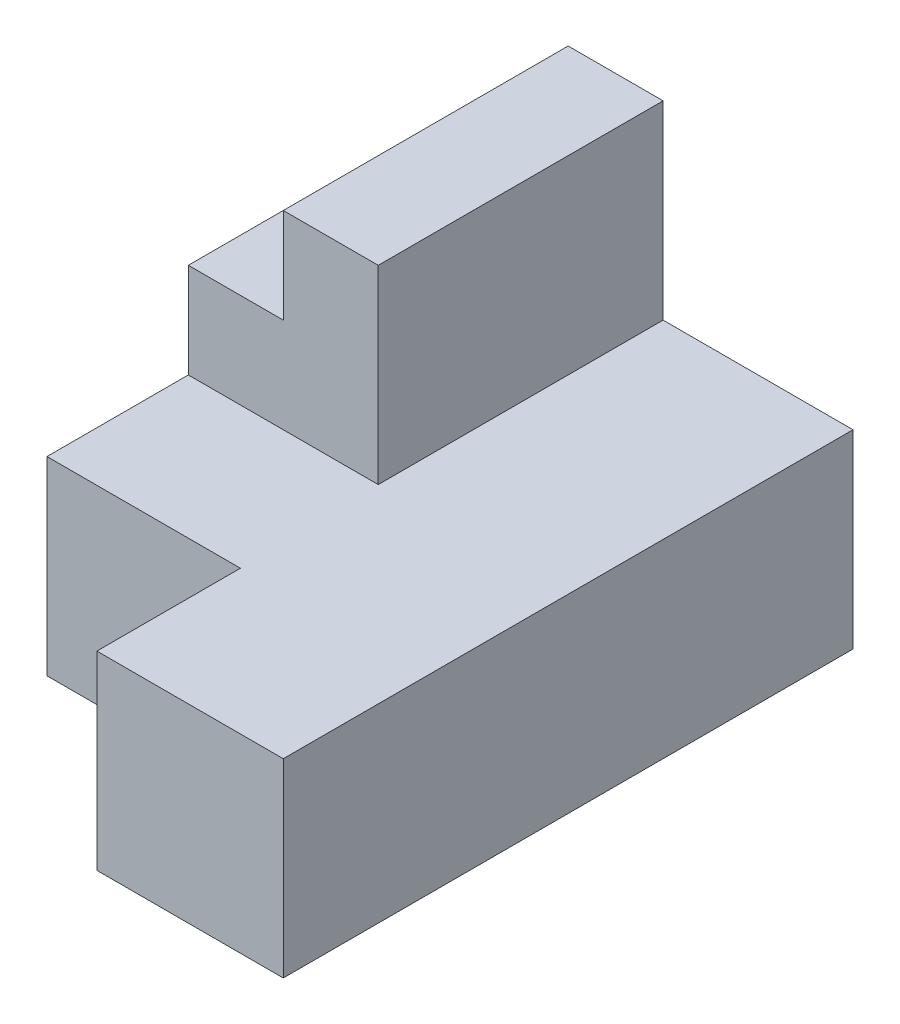
ISO-10303-21;
HEADER;
FILE_DESCRIPTION(('STEP AP214'),'2;1');
FILE_NAME('part.step','',(''),(''),'','','');
FILE_SCHEMA(('AUTOMOTIVE_DESIGN { 1 0 10303 214 1 1 1 1 }'));
ENDSEC;
DATA;
#1=APPLICATION_CONTEXT('core data for automotive mechanical design processes');
#2=APPLICATION_PROTOCOL_DEFINITION('international standard','automotive_design',2000,#1);
#3=PRODUCT_CONTEXT('',#1,'mechanical');
#4=PRODUCT('Part','Part','',(#3));
#5=PRODUCT_RELATED_PRODUCT_CATEGORY('part','',(#4));
#6=PRODUCT_DEFINITION_FORMATION('','',#4);
#7=PRODUCT_DEFINITION_CONTEXT('part definition',#1,'design');
#8=PRODUCT_DEFINITION('design','',#6,#7);
#9=PRODUCT_DEFINITION_SHAPE('','',#8);
#10=(LENGTH_UNIT() NAMED_UNIT(*) SI_UNIT(.MILLI.,.METRE.));
#11=(NAMED_UNIT(*) PLANE_ANGLE_UNIT() SI_UNIT($,.RADIAN.));
#12=(NAMED_UNIT(*) SI_UNIT($,.STERADIAN.) SOLID_ANGLE_UNIT());
#13=UNCERTAINTY_MEASURE_WITH_UNIT(LENGTH_MEASURE(1.E-05),#10,'distance_accuracy_value','');
#14=(GEOMETRIC_REPRESENTATION_CONTEXT(3) GLOBAL_UNCERTAINTY_ASSIGNED_CONTEXT((#13)) GLOBAL_UNIT_ASSIGNED_CONTEXT((#10,
#11,#12)) REPRESENTATION_CONTEXT('',''));
#15=CARTESIAN_POINT('',(0.,0.,0.));
#16=DIRECTION('',(0.,0.,1.));
#17=DIRECTION('',(1.,0.,0.));
#18=AXIS2_PLACEMENT_3D('',#15,#16,#17);
#19=CARTESIAN_POINT('',(0.,0.,60.));
#20=DIRECTION('',(1.,0.,0.));
#21=DIRECTION('',(0.,0.,-1.));
#22=AXIS2_PLACEMENT_3D('',#19,#20,#21);
#23=PLANE('',#22);
#24=DIRECTION('',(0.,0.,-1.));
#25=VECTOR('',#24,1.);
#26=CARTESIAN_POINT('',(0.,0.,60.));
#27=LINE('',#26,#25);
#28=CARTESIAN_POINT('',(0.,0.,44.8834432885845));
#29=VERTEX_POINT('',#28);
#30=CARTESIAN_POINT('',(0.,0.,0.));
#31=VERTEX_POINT('',#30);
#32=EDGE_CURVE('E11',#29,#31,#27,.T.);
#33=ORIENTED_EDGE('',*,*,#32,.F.);
#34=DIRECTION('',(0.,1.,0.));
#35=VECTOR('',#34,1.);
#36=CARTESIAN_POINT('',(0.,0.,44.8834432885845));
#37=LINE('',#36,#35);
#38=CARTESIAN_POINT('',(0.,20.,44.8834432885845));
#39=VERTEX_POINT('',#38);
#40=EDGE_CURVE('E205',#29,#39,#37,.T.);
#41=ORIENTED_EDGE('',*,*,#40,.T.);
#42=DIRECTION('',(0.,0.,1.));
#43=VECTOR('',#42,1.);
#44=CARTESIAN_POINT('',(0.,20.,60.));
#45=LINE('',#44,#43);
#46=CARTESIAN_POINT('',(0.,20.,30.));
#47=VERTEX_POINT('',#46);
#48=EDGE_CURVE('E204',#47,#39,#45,.T.);
#49=ORIENTED_EDGE('',*,*,#48,.F.);
#50=DIRECTION('',(0.,1.,0.));
#51=VECTOR('',#50,1.);
#52=CARTESIAN_POINT('',(0.,20.,30.));
#53=LINE('',#52,#51);
#54=CARTESIAN_POINT('',(0.,30.,30.));
#55=VERTEX_POINT('',#54);
#56=EDGE_CURVE('E190',#47,#55,#53,.T.);
#57=ORIENTED_EDGE('',*,*,#56,.T.);
#58=DIRECTION('',(0.,0.,1.));
#59=VECTOR('',#58,1.);
#60=CARTESIAN_POINT('',(0.,30.,0.));
#61=LINE('',#60,#59);
#62=CARTESIAN_POINT('',(0.,30.,0.));
#63=VERTEX_POINT('',#62);
#64=EDGE_CURVE('E189',#63,#55,#61,.T.);
#65=ORIENTED_EDGE('',*,*,#64,.F.);
#66=DIRECTION('',(0.,-1.,0.));
#67=VECTOR('',#66,1.);
#68=CARTESIAN_POINT('',(0.,0.,0.));
#69=LINE('',#68,#67);
#70=EDGE_CURVE('E146',#63,#31,#69,.T.);
#71=ORIENTED_EDGE('',*,*,#70,.T.);
#72=EDGE_LOOP('',(#33,#41,#49,#57,#65,#71));
#73=FACE_BOUND('',#72,.T.);
#74=ADVANCED_FACE('F33',(#73),#23,.F.);
#75=CARTESIAN_POINT('',(0.,0.,60.));
#76=DIRECTION('',(0.,1.,0.));
#77=DIRECTION('',(0.,0.,1.));
#78=AXIS2_PLACEMENT_3D('',#75,#76,#77);
#79=PLANE('',#78);
#80=DIRECTION('',(0.,0.,-1.));
#81=VECTOR('',#80,1.);
#82=CARTESIAN_POINT('',(20.3690109906259,0.,60.));
#83=LINE('',#82,#81);
#84=CARTESIAN_POINT('',(20.3690109906259,0.,60.));
#85=VERTEX_POINT('',#84);
#86=CARTESIAN_POINT('',(20.3690109906259,0.,44.8834432885845));
#87=VERTEX_POINT('',#86);
#88=EDGE_CURVE('E114',#85,#87,#83,.T.);
#89=ORIENTED_EDGE('',*,*,#88,.T.);
#90=DIRECTION('',(-1.,0.,0.));
#91=VECTOR('',#90,1.);
#92=CARTESIAN_POINT('',(0.,0.,44.8834432885845));
#93=LINE('',#92,#91);
#94=EDGE_CURVE('E121',#87,#29,#93,.T.);
#95=ORIENTED_EDGE('',*,*,#94,.T.);
#96=ORIENTED_EDGE('',*,*,#32,.T.);
#97=DIRECTION('',(1.,0.,0.));
#98=VECTOR('',#97,1.);
#99=CARTESIAN_POINT('',(0.,0.,0.));
#100=LINE('',#99,#98);
#101=CARTESIAN_POINT('',(40.,0.,0.));
#102=VERTEX_POINT('',#101);
#103=EDGE_CURVE('E149',#31,#102,#100,.T.);
#104=ORIENTED_EDGE('',*,*,#103,.T.);
#105=DIRECTION('',(0.,0.,-1.));
#106=VECTOR('',#105,1.);
#107=CARTESIAN_POINT('',(40.,0.,60.));
#108=LINE('',#107,#106);
#109=CARTESIAN_POINT('',(40.,0.,60.));
#110=VERTEX_POINT('',#109);
#111=EDGE_CURVE('E40',#110,#102,#108,.T.);
#112=ORIENTED_EDGE('',*,*,#111,.F.);
#113=DIRECTION('',(1.,0.,0.));
#114=VECTOR('',#113,1.);
#115=CARTESIAN_POINT('',(0.,0.,60.));
#116=LINE('',#115,#114);
#117=EDGE_CURVE('E128',#85,#110,#116,.T.);
#118=ORIENTED_EDGE('',*,*,#117,.F.);
#119=EDGE_LOOP('',(#89,#95,#96,#104,#112,#118));
#120=FACE_BOUND('',#119,.T.);
#121=ADVANCED_FACE('F132',(#120),#79,.F.);
#122=CARTESIAN_POINT('',(40.,0.,60.));
#123=DIRECTION('',(-1.,0.,0.));
#124=DIRECTION('',(0.,0.,1.));
#125=AXIS2_PLACEMENT_3D('',#122,#123,#124);
#126=PLANE('',#125);
#127=DIRECTION('',(0.,1.,0.));
#128=VECTOR('',#127,1.);
#129=CARTESIAN_POINT('',(40.,0.,0.));
#130=LINE('',#129,#128);
#131=CARTESIAN_POINT('',(40.,20.,0.));
#132=VERTEX_POINT('',#131);
#133=EDGE_CURVE('E140',#102,#132,#130,.T.);
#134=ORIENTED_EDGE('',*,*,#133,.T.);
#135=DIRECTION('',(0.,0.,-1.));
#136=VECTOR('',#135,1.);
#137=CARTESIAN_POINT('',(40.,20.,0.));
#138=LINE('',#137,#136);
#139=CARTESIAN_POINT('',(40.,20.,60.));
#140=VERTEX_POINT('',#139);
#141=EDGE_CURVE('E169',#140,#132,#138,.T.);
#142=ORIENTED_EDGE('',*,*,#141,.F.);
#143=DIRECTION('',(0.,1.,0.));
#144=VECTOR('',#143,1.);
#145=CARTESIAN_POINT('',(40.,0.,60.));
#146=LINE('',#145,#144);
#147=EDGE_CURVE('E135',#110,#140,#146,.T.);
#148=ORIENTED_EDGE('',*,*,#147,.F.);
#149=ORIENTED_EDGE('',*,*,#111,.T.);
#150=EDGE_LOOP('',(#134,#142,#148,#149));
#151=FACE_BOUND('',#150,.T.);
#152=ADVANCED_FACE('F154',(#151),#126,.F.);
#153=CARTESIAN_POINT('',(0.,40.,60.));
#154=DIRECTION('',(0.,-1.,0.));
#155=DIRECTION('',(0.,0.,-1.));
#156=AXIS2_PLACEMENT_3D('',#153,#154,#155);
#157=PLANE('',#156);
#158=DIRECTION('',(0.,0.,-1.));
#159=VECTOR('',#158,1.);
#160=CARTESIAN_POINT('',(10.,40.,0.));
#161=LINE('',#160,#159);
#162=CARTESIAN_POINT('',(10.,40.,30.));
#163=VERTEX_POINT('',#162);
#164=CARTESIAN_POINT('',(10.,40.,0.));
#165=VERTEX_POINT('',#164);
#166=EDGE_CURVE('E187',#163,#165,#161,.T.);
#167=ORIENTED_EDGE('',*,*,#166,.F.);
#168=DIRECTION('',(-1.,0.,0.));
#169=VECTOR('',#168,1.);
#170=CARTESIAN_POINT('',(0.,40.,30.));
#171=LINE('',#170,#169);
#172=CARTESIAN_POINT('',(20.,40.,30.));
#173=VERTEX_POINT('',#172);
#174=EDGE_CURVE('E202',#173,#163,#171,.T.);
#175=ORIENTED_EDGE('',*,*,#174,.F.);
#176=DIRECTION('',(0.,0.,1.));
#177=VECTOR('',#176,1.);
#178=CARTESIAN_POINT('',(20.,40.,0.));
#179=LINE('',#178,#177);
#180=CARTESIAN_POINT('',(20.,40.,0.));
#181=VERTEX_POINT('',#180);
#182=EDGE_CURVE('E172',#181,#173,#179,.T.);
#183=ORIENTED_EDGE('',*,*,#182,.F.);
#184=DIRECTION('',(-1.,0.,0.));
#185=VECTOR('',#184,1.);
#186=CARTESIAN_POINT('',(0.,40.,0.));
#187=LINE('',#186,#185);
#188=EDGE_CURVE('E136',#181,#165,#187,.T.);
#189=ORIENTED_EDGE('',*,*,#188,.T.);
#190=EDGE_LOOP('',(#167,#175,#183,#189));
#191=FACE_BOUND('',#190,.T.);
#192=ADVANCED_FACE('F230',(#191),#157,.F.);
#193=CARTESIAN_POINT('',(0.,0.,60.));
#194=DIRECTION('',(0.,0.,-1.));
#195=DIRECTION('',(-1.,0.,0.));
#196=AXIS2_PLACEMENT_3D('',#193,#194,#195);
#197=PLANE('',#196);
#198=DIRECTION('',(1.,0.,0.));
#199=VECTOR('',#198,1.);
#200=CARTESIAN_POINT('',(40.,20.,60.));
#201=LINE('',#200,#199);
#202=CARTESIAN_POINT('',(20.3690109906259,20.,60.));
#203=VERTEX_POINT('',#202);
#204=EDGE_CURVE('E130',#203,#140,#201,.T.);
#205=ORIENTED_EDGE('',*,*,#204,.F.);
#206=DIRECTION('',(0.,1.,0.));
#207=VECTOR('',#206,1.);
#208=CARTESIAN_POINT('',(20.3690109906259,0.,60.));
#209=LINE('',#208,#207);
#210=EDGE_CURVE('E47',#85,#203,#209,.T.);
#211=ORIENTED_EDGE('',*,*,#210,.F.);
#212=ORIENTED_EDGE('',*,*,#117,.T.);
#213=ORIENTED_EDGE('',*,*,#147,.T.);
#214=EDGE_LOOP('',(#205,#211,#212,#213));
#215=FACE_BOUND('',#214,.T.);
#216=ADVANCED_FACE('F126',(#215),#197,.F.);
#217=CARTESIAN_POINT('',(0.,0.,0.));
#218=DIRECTION('',(0.,0.,-1.));
#219=DIRECTION('',(-1.,0.,0.));
#220=AXIS2_PLACEMENT_3D('',#217,#218,#219);
#221=PLANE('',#220);
#222=DIRECTION('',(0.,1.,0.));
#223=VECTOR('',#222,1.);
#224=CARTESIAN_POINT('',(10.,30.,0.));
#225=LINE('',#224,#223);
#226=CARTESIAN_POINT('',(10.,30.,0.));
#227=VERTEX_POINT('',#226);
#228=EDGE_CURVE('E177',#227,#165,#225,.T.);
#229=ORIENTED_EDGE('',*,*,#228,.T.);
#230=ORIENTED_EDGE('',*,*,#188,.F.);
#231=DIRECTION('',(0.,1.,0.));
#232=VECTOR('',#231,1.);
#233=CARTESIAN_POINT('',(20.,20.,0.));
#234=LINE('',#233,#232);
#235=CARTESIAN_POINT('',(20.,20.,0.));
#236=VERTEX_POINT('',#235);
#237=EDGE_CURVE('E143',#236,#181,#234,.T.);
#238=ORIENTED_EDGE('',*,*,#237,.F.);
#239=DIRECTION('',(-1.,0.,0.));
#240=VECTOR('',#239,1.);
#241=CARTESIAN_POINT('',(40.,20.,0.));
#242=LINE('',#241,#240);
#243=EDGE_CURVE('E164',#132,#236,#242,.T.);
#244=ORIENTED_EDGE('',*,*,#243,.F.);
#245=ORIENTED_EDGE('',*,*,#133,.F.);
#246=ORIENTED_EDGE('',*,*,#103,.F.);
#247=ORIENTED_EDGE('',*,*,#70,.F.);
#248=DIRECTION('',(-1.,0.,0.));
#249=VECTOR('',#248,1.);
#250=CARTESIAN_POINT('',(10.,30.,0.));
#251=LINE('',#250,#249);
#252=EDGE_CURVE('E185',#227,#63,#251,.T.);
#253=ORIENTED_EDGE('',*,*,#252,.F.);
#254=EDGE_LOOP('',(#229,#230,#238,#244,#245,#246,#247,#253));
#255=FACE_BOUND('',#254,.T.);
#256=ADVANCED_FACE('F160',(#255),#221,.T.);
#257=CARTESIAN_POINT('',(20.,20.,0.));
#258=DIRECTION('',(-1.,0.,0.));
#259=DIRECTION('',(0.,0.,1.));
#260=AXIS2_PLACEMENT_3D('',#257,#258,#259);
#261=PLANE('',#260);
#262=ORIENTED_EDGE('',*,*,#182,.T.);
#263=DIRECTION('',(0.,1.,0.));
#264=VECTOR('',#263,1.);
#265=CARTESIAN_POINT('',(20.,20.,30.));
#266=LINE('',#265,#264);
#267=CARTESIAN_POINT('',(20.,20.,30.));
#268=VERTEX_POINT('',#267);
#269=EDGE_CURVE('E197',#268,#173,#266,.T.);
#270=ORIENTED_EDGE('',*,*,#269,.F.);
#271=DIRECTION('',(0.,0.,1.));
#272=VECTOR('',#271,1.);
#273=CARTESIAN_POINT('',(20.,20.,0.));
#274=LINE('',#273,#272);
#275=EDGE_CURVE('E168',#236,#268,#274,.T.);
#276=ORIENTED_EDGE('',*,*,#275,.F.);
#277=ORIENTED_EDGE('',*,*,#237,.T.);
#278=EDGE_LOOP('',(#262,#270,#276,#277));
#279=FACE_BOUND('',#278,.T.);
#280=ADVANCED_FACE('F227',(#279),#261,.F.);
#281=CARTESIAN_POINT('',(0.,20.,0.));
#282=DIRECTION('',(0.,-1.,0.));
#283=DIRECTION('',(0.,0.,-1.));
#284=AXIS2_PLACEMENT_3D('',#281,#282,#283);
#285=PLANE('',#284);
#286=ORIENTED_EDGE('',*,*,#48,.T.);
#287=DIRECTION('',(-1.,0.,0.));
#288=VECTOR('',#287,1.);
#289=CARTESIAN_POINT('',(0.,20.,44.8834432885845));
#290=LINE('',#289,#288);
#291=CARTESIAN_POINT('',(20.3690109906259,20.,44.8834432885845));
#292=VERTEX_POINT('',#291);
#293=EDGE_CURVE('E122',#292,#39,#290,.T.);
#294=ORIENTED_EDGE('',*,*,#293,.F.);
#295=DIRECTION('',(0.,0.,-1.));
#296=VECTOR('',#295,1.);
#297=CARTESIAN_POINT('',(20.3690109906259,20.,60.));
#298=LINE('',#297,#296);
#299=EDGE_CURVE('E214',#203,#292,#298,.T.);
#300=ORIENTED_EDGE('',*,*,#299,.F.);
#301=ORIENTED_EDGE('',*,*,#204,.T.);
#302=ORIENTED_EDGE('',*,*,#141,.T.);
#303=ORIENTED_EDGE('',*,*,#243,.T.);
#304=ORIENTED_EDGE('',*,*,#275,.T.);
#305=DIRECTION('',(-1.,0.,0.));
#306=VECTOR('',#305,1.);
#307=CARTESIAN_POINT('',(0.,20.,30.));
#308=LINE('',#307,#306);
#309=EDGE_CURVE('E199',#268,#47,#308,.T.);
#310=ORIENTED_EDGE('',*,*,#309,.T.);
#311=EDGE_LOOP('',(#286,#294,#300,#301,#302,#303,#304,#310));
#312=FACE_BOUND('',#311,.T.);
#313=ADVANCED_FACE('F225',(#312),#285,.F.);
#314=CARTESIAN_POINT('',(10.,30.,0.));
#315=DIRECTION('',(1.,0.,0.));
#316=DIRECTION('',(0.,0.,-1.));
#317=AXIS2_PLACEMENT_3D('',#314,#315,#316);
#318=PLANE('',#317);
#319=ORIENTED_EDGE('',*,*,#166,.T.);
#320=ORIENTED_EDGE('',*,*,#228,.F.);
#321=DIRECTION('',(0.,0.,-1.));
#322=VECTOR('',#321,1.);
#323=CARTESIAN_POINT('',(10.,30.,0.));
#324=LINE('',#323,#322);
#325=CARTESIAN_POINT('',(10.,30.,30.));
#326=VERTEX_POINT('',#325);
#327=EDGE_CURVE('E55',#326,#227,#324,.T.);
#328=ORIENTED_EDGE('',*,*,#327,.F.);
#329=DIRECTION('',(0.,1.,0.));
#330=VECTOR('',#329,1.);
#331=CARTESIAN_POINT('',(10.,30.,30.));
#332=LINE('',#331,#330);
#333=EDGE_CURVE('E181',#326,#163,#332,.T.);
#334=ORIENTED_EDGE('',*,*,#333,.T.);
#335=EDGE_LOOP('',(#319,#320,#328,#334));
#336=FACE_BOUND('',#335,.T.);
#337=ADVANCED_FACE('F232',(#336),#318,.F.);
#338=CARTESIAN_POINT('',(0.,30.,0.));
#339=DIRECTION('',(0.,-1.,0.));
#340=DIRECTION('',(0.,0.,-1.));
#341=AXIS2_PLACEMENT_3D('',#338,#339,#340);
#342=PLANE('',#341);
#343=ORIENTED_EDGE('',*,*,#64,.T.);
#344=DIRECTION('',(1.,0.,0.));
#345=VECTOR('',#344,1.);
#346=CARTESIAN_POINT('',(10.,30.,30.));
#347=LINE('',#346,#345);
#348=EDGE_CURVE('E193',#55,#326,#347,.T.);
#349=ORIENTED_EDGE('',*,*,#348,.T.);
#350=ORIENTED_EDGE('',*,*,#327,.T.);
#351=ORIENTED_EDGE('',*,*,#252,.T.);
#352=EDGE_LOOP('',(#343,#349,#350,#351));
#353=FACE_BOUND('',#352,.T.);
#354=ADVANCED_FACE('F221',(#353),#342,.F.);
#355=CARTESIAN_POINT('',(0.,20.,30.));
#356=DIRECTION('',(0.,0.,-1.));
#357=DIRECTION('',(-1.,0.,0.));
#358=AXIS2_PLACEMENT_3D('',#355,#356,#357);
#359=PLANE('',#358);
#360=ORIENTED_EDGE('',*,*,#348,.F.);
#361=ORIENTED_EDGE('',*,*,#56,.F.);
#362=ORIENTED_EDGE('',*,*,#309,.F.);
#363=ORIENTED_EDGE('',*,*,#269,.T.);
#364=ORIENTED_EDGE('',*,*,#174,.T.);
#365=ORIENTED_EDGE('',*,*,#333,.F.);
#366=EDGE_LOOP('',(#360,#361,#362,#363,#364,#365));
#367=FACE_BOUND('',#366,.T.);
#368=ADVANCED_FACE('F223',(#367),#359,.F.);
#369=CARTESIAN_POINT('',(0.,0.,44.8834432885845));
#370=DIRECTION('',(0.,0.,-1.));
#371=DIRECTION('',(-1.,0.,0.));
#372=AXIS2_PLACEMENT_3D('',#369,#370,#371);
#373=PLANE('',#372);
#374=ORIENTED_EDGE('',*,*,#293,.T.);
#375=ORIENTED_EDGE('',*,*,#40,.F.);
#376=ORIENTED_EDGE('',*,*,#94,.F.);
#377=DIRECTION('',(0.,1.,0.));
#378=VECTOR('',#377,1.);
#379=CARTESIAN_POINT('',(20.3690109906259,0.,44.8834432885845));
#380=LINE('',#379,#378);
#381=EDGE_CURVE('E116',#87,#292,#380,.T.);
#382=ORIENTED_EDGE('',*,*,#381,.T.);
#383=EDGE_LOOP('',(#374,#375,#376,#382));
#384=FACE_BOUND('',#383,.T.);
#385=ADVANCED_FACE('F277',(#384),#373,.F.);
#386=CARTESIAN_POINT('',(20.3690109906259,0.,60.));
#387=DIRECTION('',(1.,0.,0.));
#388=DIRECTION('',(0.,0.,-1.));
#389=AXIS2_PLACEMENT_3D('',#386,#387,#388);
#390=PLANE('',#389);
#391=ORIENTED_EDGE('',*,*,#299,.T.);
#392=ORIENTED_EDGE('',*,*,#381,.F.);
#393=ORIENTED_EDGE('',*,*,#88,.F.);
#394=ORIENTED_EDGE('',*,*,#210,.T.);
#395=EDGE_LOOP('',(#391,#392,#393,#394));
#396=FACE_BOUND('',#395,.T.);
#397=ADVANCED_FACE('F115',(#396),#390,.F.);
#398=CLOSED_SHELL('',(#74,#121,#152,#192,#216,#256,#280,#313,#337,#354,#368,#385,#397));
#399=MANIFOLD_SOLID_BREP('B2',#398);
#400=ADVANCED_BREP_SHAPE_REPRESENTATION('',(#18,#399),#14);
#401=SHAPE_DEFINITION_REPRESENTATION(#9,#400);
ENDSEC;
END-ISO-10303-21;
